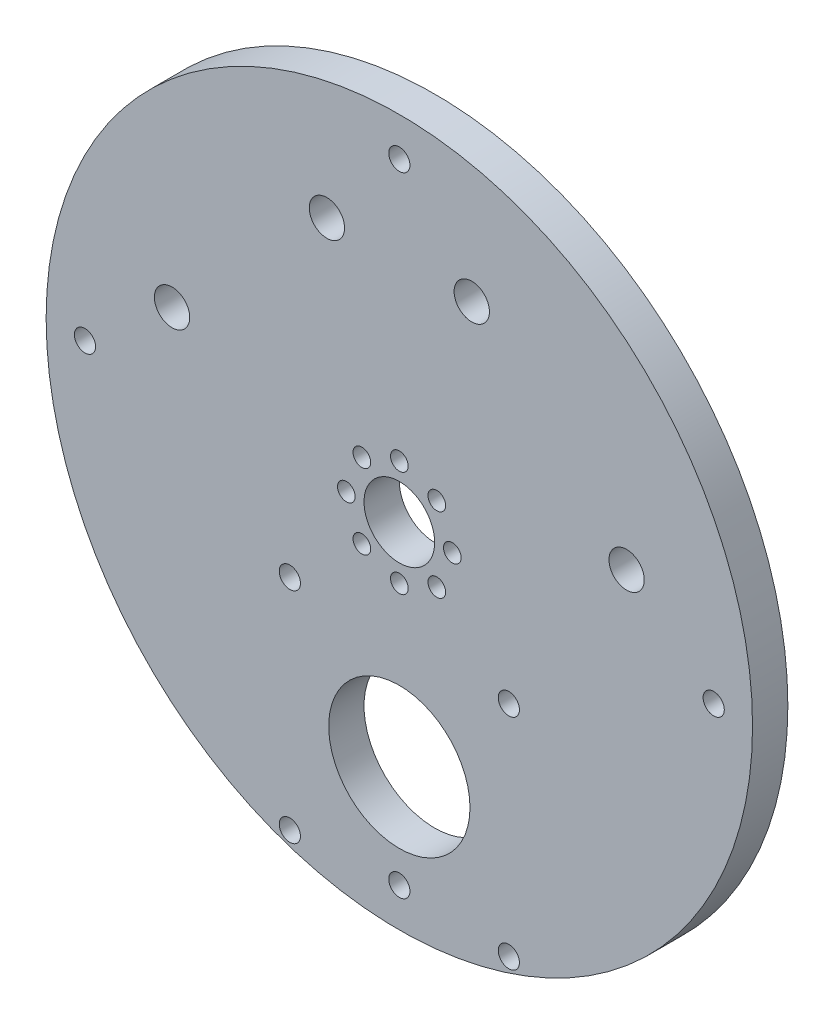
ISO-10303-21;
HEADER;
FILE_DESCRIPTION(('STEP AP214'),'2;1');
FILE_NAME('part.step','',(''),(''),'','','');
FILE_SCHEMA(('AUTOMOTIVE_DESIGN { 1 0 10303 214 1 1 1 1 }'));
ENDSEC;
DATA;
#1=APPLICATION_CONTEXT('core data for automotive mechanical design processes');
#2=APPLICATION_PROTOCOL_DEFINITION('international standard','automotive_design',2000,#1);
#3=PRODUCT_CONTEXT('',#1,'mechanical');
#4=PRODUCT('Part','Part','',(#3));
#5=PRODUCT_RELATED_PRODUCT_CATEGORY('part','',(#4));
#6=PRODUCT_DEFINITION_FORMATION('','',#4);
#7=PRODUCT_DEFINITION_CONTEXT('part definition',#1,'design');
#8=PRODUCT_DEFINITION('design','',#6,#7);
#9=PRODUCT_DEFINITION_SHAPE('','',#8);
#10=(LENGTH_UNIT() NAMED_UNIT(*) SI_UNIT(.MILLI.,.METRE.));
#11=(NAMED_UNIT(*) PLANE_ANGLE_UNIT() SI_UNIT($,.RADIAN.));
#12=(NAMED_UNIT(*) SI_UNIT($,.STERADIAN.) SOLID_ANGLE_UNIT());
#13=UNCERTAINTY_MEASURE_WITH_UNIT(LENGTH_MEASURE(1.E-05),#10,'distance_accuracy_value','');
#14=(GEOMETRIC_REPRESENTATION_CONTEXT(3) GLOBAL_UNCERTAINTY_ASSIGNED_CONTEXT((#13)) GLOBAL_UNIT_ASSIGNED_CONTEXT((#10,
#11,#12)) REPRESENTATION_CONTEXT('',''));
#15=CARTESIAN_POINT('',(0.,0.,0.));
#16=DIRECTION('',(0.,0.,1.));
#17=DIRECTION('',(1.,0.,0.));
#18=AXIS2_PLACEMENT_3D('',#15,#16,#17);
#19=CARTESIAN_POINT('',(0.,0.,5.));
#20=DIRECTION('',(0.,0.,1.));
#21=DIRECTION('',(1.,0.,0.));
#22=AXIS2_PLACEMENT_3D('',#19,#20,#21);
#23=PLANE('',#22);
#24=CARTESIAN_POINT('',(15.5,-45.5,5.));
#25=DIRECTION('',(0.,0.,1.));
#26=DIRECTION('',(1.,0.,0.));
#27=AXIS2_PLACEMENT_3D('',#24,#25,#26);
#28=CIRCLE('',#27,1.5);
#29=CARTESIAN_POINT('',(17.,-45.5,5.));
#30=VERTEX_POINT('',#29);
#31=EDGE_CURVE('E170',#30,#30,#28,.T.);
#32=ORIENTED_EDGE('',*,*,#31,.F.);
#33=EDGE_LOOP('',(#32));
#34=FACE_BOUND('',#33,.T.);
#35=CARTESIAN_POINT('',(-15.5,-14.5,5.));
#36=DIRECTION('',(0.,0.,1.));
#37=DIRECTION('',(1.,0.,0.));
#38=AXIS2_PLACEMENT_3D('',#35,#36,#37);
#39=CIRCLE('',#38,1.5);
#40=CARTESIAN_POINT('',(-14.,-14.5,5.));
#41=VERTEX_POINT('',#40);
#42=EDGE_CURVE('E158',#41,#41,#39,.T.);
#43=ORIENTED_EDGE('',*,*,#42,.F.);
#44=EDGE_LOOP('',(#43));
#45=FACE_BOUND('',#44,.T.);
#46=CARTESIAN_POINT('',(32.1733585439879,10.2530483272049,5.));
#47=DIRECTION('',(0.,0.,1.));
#48=DIRECTION('',(-1.,0.,0.));
#49=AXIS2_PLACEMENT_3D('',#46,#47,#48);
#50=CIRCLE('',#49,2.5);
#51=CARTESIAN_POINT('',(29.6733585439879,10.2530483272049,5.));
#52=VERTEX_POINT('',#51);
#53=EDGE_CURVE('E146',#52,#52,#50,.T.);
#54=ORIENTED_EDGE('',*,*,#53,.F.);
#55=EDGE_LOOP('',(#54));
#56=FACE_BOUND('',#55,.T.);
#57=CARTESIAN_POINT('',(-32.1733585439879,10.2530483272049,5.));
#58=DIRECTION('',(0.,0.,1.));
#59=DIRECTION('',(1.,0.,0.));
#60=AXIS2_PLACEMENT_3D('',#57,#58,#59);
#61=CIRCLE('',#60,2.5);
#62=CARTESIAN_POINT('',(-29.6733585439879,10.2530483272049,5.));
#63=VERTEX_POINT('',#62);
#64=EDGE_CURVE('E134',#63,#63,#61,.T.);
#65=ORIENTED_EDGE('',*,*,#64,.F.);
#66=EDGE_LOOP('',(#65));
#67=FACE_BOUND('',#66,.T.);
#68=CARTESIAN_POINT('',(-5.30330085889904,5.30330085889917,5.));
#69=DIRECTION('',(0.,0.,1.));
#70=DIRECTION('',(1.,0.,0.));
#71=AXIS2_PLACEMENT_3D('',#68,#69,#70);
#72=CIRCLE('',#71,1.25);
#73=CARTESIAN_POINT('',(-4.05330085889904,5.30330085889917,5.));
#74=VERTEX_POINT('',#73);
#75=EDGE_CURVE('E122',#74,#74,#72,.T.);
#76=ORIENTED_EDGE('',*,*,#75,.F.);
#77=EDGE_LOOP('',(#76));
#78=FACE_BOUND('',#77,.T.);
#79=CARTESIAN_POINT('',(-5.30330085889802,-5.30330085889956,5.));
#80=DIRECTION('',(0.,0.,1.));
#81=DIRECTION('',(1.,0.,0.));
#82=AXIS2_PLACEMENT_3D('',#79,#80,#81);
#83=CIRCLE('',#82,1.25000000000124);
#84=CARTESIAN_POINT('',(-4.05330085889678,-5.30330085889956,5.));
#85=VERTEX_POINT('',#84);
#86=EDGE_CURVE('E110',#85,#85,#83,.T.);
#87=ORIENTED_EDGE('',*,*,#86,.F.);
#88=EDGE_LOOP('',(#87));
#89=FACE_BOUND('',#88,.T.);
#90=CARTESIAN_POINT('',(5.3033008589002,-5.30330085889865,5.));
#91=DIRECTION('',(0.,0.,1.));
#92=DIRECTION('',(1.,0.,0.));
#93=AXIS2_PLACEMENT_3D('',#90,#91,#92);
#94=CIRCLE('',#93,1.25000000000095);
#95=CARTESIAN_POINT('',(6.55330085890114,-5.30330085889865,5.));
#96=VERTEX_POINT('',#95);
#97=EDGE_CURVE('E98',#96,#96,#94,.T.);
#98=ORIENTED_EDGE('',*,*,#97,.F.);
#99=EDGE_LOOP('',(#98));
#100=FACE_BOUND('',#99,.T.);
#101=CARTESIAN_POINT('',(5.30330085889912,5.3033008588991,5.));
#102=DIRECTION('',(0.,0.,1.));
#103=DIRECTION('',(1.,0.,0.));
#104=AXIS2_PLACEMENT_3D('',#101,#102,#103);
#105=CIRCLE('',#104,1.25);
#106=CARTESIAN_POINT('',(6.55330085889912,5.3033008588991,5.));
#107=VERTEX_POINT('',#106);
#108=EDGE_CURVE('E86',#107,#107,#105,.T.);
#109=ORIENTED_EDGE('',*,*,#108,.F.);
#110=EDGE_LOOP('',(#109));
#111=FACE_BOUND('',#110,.T.);
#112=CARTESIAN_POINT('',(-44.4999999999987,-1.26204123052488E-12,5.));
#113=DIRECTION('',(0.,0.,1.));
#114=DIRECTION('',(1.,0.,0.));
#115=AXIS2_PLACEMENT_3D('',#112,#113,#114);
#116=CIRCLE('',#115,1.50000000000202);
#117=CARTESIAN_POINT('',(-42.9999999999967,-1.26204123052488E-12,5.));
#118=VERTEX_POINT('',#117);
#119=EDGE_CURVE('E74',#118,#118,#116,.T.);
#120=ORIENTED_EDGE('',*,*,#119,.F.);
#121=EDGE_LOOP('',(#120));
#122=FACE_BOUND('',#121,.T.);
#123=CARTESIAN_POINT('',(44.5000000000012,1.25659155226867E-12,5.));
#124=DIRECTION('',(0.,0.,1.));
#125=DIRECTION('',(1.,0.,0.));
#126=AXIS2_PLACEMENT_3D('',#123,#124,#125);
#127=CIRCLE('',#126,1.50000000000099);
#128=CARTESIAN_POINT('',(46.0000000000022,1.25659155226867E-12,5.));
#129=VERTEX_POINT('',#128);
#130=EDGE_CURVE('E62',#129,#129,#127,.T.);
#131=ORIENTED_EDGE('',*,*,#130,.F.);
#132=EDGE_LOOP('',(#131));
#133=FACE_BOUND('',#132,.T.);
#134=CARTESIAN_POINT('',(0.,44.5,5.));
#135=DIRECTION('',(0.,0.,1.));
#136=DIRECTION('',(1.,0.,0.));
#137=AXIS2_PLACEMENT_3D('',#134,#135,#136);
#138=CIRCLE('',#137,1.5);
#139=CARTESIAN_POINT('',(1.5,44.5,5.));
#140=VERTEX_POINT('',#139);
#141=EDGE_CURVE('E51',#140,#140,#138,.T.);
#142=ORIENTED_EDGE('',*,*,#141,.F.);
#143=EDGE_LOOP('',(#142));
#144=FACE_BOUND('',#143,.T.);
#145=CARTESIAN_POINT('',(0.,0.,5.));
#146=DIRECTION('',(0.,0.,1.));
#147=DIRECTION('',(1.,0.,0.));
#148=AXIS2_PLACEMENT_3D('',#145,#146,#147);
#149=CIRCLE('',#148,50.);
#150=CARTESIAN_POINT('',(50.,0.,5.));
#151=VERTEX_POINT('',#150);
#152=EDGE_CURVE('E10',#151,#151,#149,.T.);
#153=ORIENTED_EDGE('',*,*,#152,.T.);
#154=EDGE_LOOP('',(#153));
#155=FACE_BOUND('',#154,.T.);
#156=CARTESIAN_POINT('',(0.,7.5,5.));
#157=DIRECTION('',(0.,0.,1.));
#158=DIRECTION('',(1.,0.,0.));
#159=AXIS2_PLACEMENT_3D('',#156,#157,#158);
#160=CIRCLE('',#159,1.25);
#161=CARTESIAN_POINT('',(1.25,7.5,5.));
#162=VERTEX_POINT('',#161);
#163=EDGE_CURVE('E56',#162,#162,#160,.T.);
#164=ORIENTED_EDGE('',*,*,#163,.F.);
#165=EDGE_LOOP('',(#164));
#166=FACE_BOUND('',#165,.T.);
#167=CARTESIAN_POINT('',(2.51318310453734E-12,-44.5,5.));
#168=DIRECTION('',(0.,0.,1.));
#169=DIRECTION('',(1.,0.,0.));
#170=AXIS2_PLACEMENT_3D('',#167,#168,#169);
#171=CIRCLE('',#170,1.5000000000027);
#172=CARTESIAN_POINT('',(1.50000000000522,-44.5,5.));
#173=VERTEX_POINT('',#172);
#174=EDGE_CURVE('E68',#173,#173,#171,.T.);
#175=ORIENTED_EDGE('',*,*,#174,.F.);
#176=EDGE_LOOP('',(#175));
#177=FACE_BOUND('',#176,.T.);
#178=CARTESIAN_POINT('',(0.,0.,5.));
#179=DIRECTION('',(0.,0.,1.));
#180=DIRECTION('',(1.,0.,0.));
#181=AXIS2_PLACEMENT_3D('',#178,#179,#180);
#182=CIRCLE('',#181,5.);
#183=CARTESIAN_POINT('',(5.,0.,5.));
#184=VERTEX_POINT('',#183);
#185=EDGE_CURVE('E80',#184,#184,#182,.T.);
#186=ORIENTED_EDGE('',*,*,#185,.F.);
#187=EDGE_LOOP('',(#186));
#188=FACE_BOUND('',#187,.T.);
#189=CARTESIAN_POINT('',(7.5,0.,5.));
#190=DIRECTION('',(0.,0.,1.));
#191=DIRECTION('',(1.,0.,0.));
#192=AXIS2_PLACEMENT_3D('',#189,#190,#191);
#193=CIRCLE('',#192,1.25);
#194=CARTESIAN_POINT('',(8.75,0.,5.));
#195=VERTEX_POINT('',#194);
#196=EDGE_CURVE('E92',#195,#195,#193,.T.);
#197=ORIENTED_EDGE('',*,*,#196,.F.);
#198=EDGE_LOOP('',(#197));
#199=FACE_BOUND('',#198,.T.);
#200=CARTESIAN_POINT('',(1.2762214690701E-12,-7.5,5.));
#201=DIRECTION('',(0.,0.,1.));
#202=DIRECTION('',(1.,0.,0.));
#203=AXIS2_PLACEMENT_3D('',#200,#201,#202);
#204=CIRCLE('',#203,1.25000000000127);
#205=CARTESIAN_POINT('',(1.25000000000255,-7.5,5.));
#206=VERTEX_POINT('',#205);
#207=EDGE_CURVE('E104',#206,#206,#204,.T.);
#208=ORIENTED_EDGE('',*,*,#207,.F.);
#209=EDGE_LOOP('',(#208));
#210=FACE_BOUND('',#209,.T.);
#211=CARTESIAN_POINT('',(-7.5,0.,5.));
#212=DIRECTION('',(0.,0.,1.));
#213=DIRECTION('',(1.,0.,0.));
#214=AXIS2_PLACEMENT_3D('',#211,#212,#213);
#215=CIRCLE('',#214,1.25);
#216=CARTESIAN_POINT('',(-6.25,0.,5.));
#217=VERTEX_POINT('',#216);
#218=EDGE_CURVE('E116',#217,#217,#215,.T.);
#219=ORIENTED_EDGE('',*,*,#218,.F.);
#220=EDGE_LOOP('',(#219));
#221=FACE_BOUND('',#220,.T.);
#222=CARTESIAN_POINT('',(-10.2530483272049,32.1733585439879,5.));
#223=DIRECTION('',(0.,0.,1.));
#224=DIRECTION('',(1.,0.,0.));
#225=AXIS2_PLACEMENT_3D('',#222,#223,#224);
#226=CIRCLE('',#225,2.5);
#227=CARTESIAN_POINT('',(-7.75304832720494,32.1733585439879,5.));
#228=VERTEX_POINT('',#227);
#229=EDGE_CURVE('E128',#228,#228,#226,.T.);
#230=ORIENTED_EDGE('',*,*,#229,.F.);
#231=EDGE_LOOP('',(#230));
#232=FACE_BOUND('',#231,.T.);
#233=CARTESIAN_POINT('',(10.2530483272049,32.1733585439879,5.));
#234=DIRECTION('',(0.,0.,1.));
#235=DIRECTION('',(-1.,0.,0.));
#236=AXIS2_PLACEMENT_3D('',#233,#234,#235);
#237=CIRCLE('',#236,2.5);
#238=CARTESIAN_POINT('',(7.75304832720494,32.1733585439879,5.));
#239=VERTEX_POINT('',#238);
#240=EDGE_CURVE('E140',#239,#239,#237,.T.);
#241=ORIENTED_EDGE('',*,*,#240,.F.);
#242=EDGE_LOOP('',(#241));
#243=FACE_BOUND('',#242,.T.);
#244=CARTESIAN_POINT('',(0.,-30.,5.));
#245=DIRECTION('',(0.,0.,1.));
#246=DIRECTION('',(1.,0.,0.));
#247=AXIS2_PLACEMENT_3D('',#244,#245,#246);
#248=CIRCLE('',#247,10.);
#249=CARTESIAN_POINT('',(10.,-30.,5.));
#250=VERTEX_POINT('',#249);
#251=EDGE_CURVE('E152',#250,#250,#248,.T.);
#252=ORIENTED_EDGE('',*,*,#251,.F.);
#253=EDGE_LOOP('',(#252));
#254=FACE_BOUND('',#253,.T.);
#255=CARTESIAN_POINT('',(15.5,-14.5,5.));
#256=DIRECTION('',(0.,0.,1.));
#257=DIRECTION('',(1.,0.,0.));
#258=AXIS2_PLACEMENT_3D('',#255,#256,#257);
#259=CIRCLE('',#258,1.5);
#260=CARTESIAN_POINT('',(17.,-14.5,5.));
#261=VERTEX_POINT('',#260);
#262=EDGE_CURVE('E164',#261,#261,#259,.T.);
#263=ORIENTED_EDGE('',*,*,#262,.F.);
#264=EDGE_LOOP('',(#263));
#265=FACE_BOUND('',#264,.T.);
#266=CARTESIAN_POINT('',(-15.5,-45.5,5.));
#267=DIRECTION('',(0.,0.,1.));
#268=DIRECTION('',(1.,0.,0.));
#269=AXIS2_PLACEMENT_3D('',#266,#267,#268);
#270=CIRCLE('',#269,1.5);
#271=CARTESIAN_POINT('',(-14.,-45.5,5.));
#272=VERTEX_POINT('',#271);
#273=EDGE_CURVE('E176',#272,#272,#270,.T.);
#274=ORIENTED_EDGE('',*,*,#273,.F.);
#275=EDGE_LOOP('',(#274));
#276=FACE_BOUND('',#275,.T.);
#277=ADVANCED_FACE('F40',(#34,#45,#56,#67,#78,#89,#100,#111,#122,#133,#144,#155,#166,#177,#188,
#199,#210,#221,#232,#243,#254,#265,#276),#23,.T.);
#278=CARTESIAN_POINT('',(0.,0.,0.));
#279=DIRECTION('',(0.,0.,1.));
#280=DIRECTION('',(1.,0.,0.));
#281=AXIS2_PLACEMENT_3D('',#278,#279,#280);
#282=PLANE('',#281);
#283=CARTESIAN_POINT('',(0.,0.,0.));
#284=DIRECTION('',(0.,0.,1.));
#285=DIRECTION('',(1.,0.,0.));
#286=AXIS2_PLACEMENT_3D('',#283,#284,#285);
#287=CIRCLE('',#286,50.);
#288=CARTESIAN_POINT('',(50.,0.,0.));
#289=VERTEX_POINT('',#288);
#290=EDGE_CURVE('E44',#289,#289,#287,.T.);
#291=ORIENTED_EDGE('',*,*,#290,.F.);
#292=EDGE_LOOP('',(#291));
#293=FACE_BOUND('',#292,.T.);
#294=CARTESIAN_POINT('',(0.,44.5,0.));
#295=DIRECTION('',(0.,0.,1.));
#296=DIRECTION('',(1.,0.,0.));
#297=AXIS2_PLACEMENT_3D('',#294,#295,#296);
#298=CIRCLE('',#297,1.5);
#299=CARTESIAN_POINT('',(1.5,44.5,0.));
#300=VERTEX_POINT('',#299);
#301=EDGE_CURVE('E53',#300,#300,#298,.T.);
#302=ORIENTED_EDGE('',*,*,#301,.T.);
#303=EDGE_LOOP('',(#302));
#304=FACE_BOUND('',#303,.T.);
#305=CARTESIAN_POINT('',(0.,7.5,0.));
#306=DIRECTION('',(0.,0.,1.));
#307=DIRECTION('',(1.,0.,0.));
#308=AXIS2_PLACEMENT_3D('',#305,#306,#307);
#309=CIRCLE('',#308,1.25);
#310=CARTESIAN_POINT('',(1.25,7.5,0.));
#311=VERTEX_POINT('',#310);
#312=EDGE_CURVE('E59',#311,#311,#309,.T.);
#313=ORIENTED_EDGE('',*,*,#312,.T.);
#314=EDGE_LOOP('',(#313));
#315=FACE_BOUND('',#314,.T.);
#316=CARTESIAN_POINT('',(44.5000000000012,1.25659155226867E-12,0.));
#317=DIRECTION('',(0.,0.,1.));
#318=DIRECTION('',(1.,0.,0.));
#319=AXIS2_PLACEMENT_3D('',#316,#317,#318);
#320=CIRCLE('',#319,1.50000000000099);
#321=CARTESIAN_POINT('',(46.0000000000022,1.25659155226867E-12,0.));
#322=VERTEX_POINT('',#321);
#323=EDGE_CURVE('E65',#322,#322,#320,.T.);
#324=ORIENTED_EDGE('',*,*,#323,.T.);
#325=EDGE_LOOP('',(#324));
#326=FACE_BOUND('',#325,.T.);
#327=CARTESIAN_POINT('',(2.51318310453734E-12,-44.5,0.));
#328=DIRECTION('',(0.,0.,1.));
#329=DIRECTION('',(1.,0.,0.));
#330=AXIS2_PLACEMENT_3D('',#327,#328,#329);
#331=CIRCLE('',#330,1.5000000000027);
#332=CARTESIAN_POINT('',(1.50000000000522,-44.5,0.));
#333=VERTEX_POINT('',#332);
#334=EDGE_CURVE('E71',#333,#333,#331,.T.);
#335=ORIENTED_EDGE('',*,*,#334,.T.);
#336=EDGE_LOOP('',(#335));
#337=FACE_BOUND('',#336,.T.);
#338=CARTESIAN_POINT('',(-44.4999999999987,-1.26204123052488E-12,0.));
#339=DIRECTION('',(0.,0.,1.));
#340=DIRECTION('',(1.,0.,0.));
#341=AXIS2_PLACEMENT_3D('',#338,#339,#340);
#342=CIRCLE('',#341,1.50000000000202);
#343=CARTESIAN_POINT('',(-42.9999999999967,-1.26204123052488E-12,0.));
#344=VERTEX_POINT('',#343);
#345=EDGE_CURVE('E77',#344,#344,#342,.T.);
#346=ORIENTED_EDGE('',*,*,#345,.T.);
#347=EDGE_LOOP('',(#346));
#348=FACE_BOUND('',#347,.T.);
#349=CARTESIAN_POINT('',(0.,0.,0.));
#350=DIRECTION('',(0.,0.,1.));
#351=DIRECTION('',(1.,0.,0.));
#352=AXIS2_PLACEMENT_3D('',#349,#350,#351);
#353=CIRCLE('',#352,5.);
#354=CARTESIAN_POINT('',(5.,0.,0.));
#355=VERTEX_POINT('',#354);
#356=EDGE_CURVE('E83',#355,#355,#353,.T.);
#357=ORIENTED_EDGE('',*,*,#356,.T.);
#358=EDGE_LOOP('',(#357));
#359=FACE_BOUND('',#358,.T.);
#360=CARTESIAN_POINT('',(5.30330085889912,5.3033008588991,0.));
#361=DIRECTION('',(0.,0.,1.));
#362=DIRECTION('',(1.,0.,0.));
#363=AXIS2_PLACEMENT_3D('',#360,#361,#362);
#364=CIRCLE('',#363,1.25);
#365=CARTESIAN_POINT('',(6.55330085889912,5.3033008588991,0.));
#366=VERTEX_POINT('',#365);
#367=EDGE_CURVE('E89',#366,#366,#364,.T.);
#368=ORIENTED_EDGE('',*,*,#367,.T.);
#369=EDGE_LOOP('',(#368));
#370=FACE_BOUND('',#369,.T.);
#371=CARTESIAN_POINT('',(7.5,0.,0.));
#372=DIRECTION('',(0.,0.,1.));
#373=DIRECTION('',(1.,0.,0.));
#374=AXIS2_PLACEMENT_3D('',#371,#372,#373);
#375=CIRCLE('',#374,1.25);
#376=CARTESIAN_POINT('',(8.75,0.,0.));
#377=VERTEX_POINT('',#376);
#378=EDGE_CURVE('E95',#377,#377,#375,.T.);
#379=ORIENTED_EDGE('',*,*,#378,.T.);
#380=EDGE_LOOP('',(#379));
#381=FACE_BOUND('',#380,.T.);
#382=CARTESIAN_POINT('',(5.3033008589002,-5.30330085889865,0.));
#383=DIRECTION('',(0.,0.,1.));
#384=DIRECTION('',(1.,0.,0.));
#385=AXIS2_PLACEMENT_3D('',#382,#383,#384);
#386=CIRCLE('',#385,1.25000000000095);
#387=CARTESIAN_POINT('',(6.55330085890114,-5.30330085889865,0.));
#388=VERTEX_POINT('',#387);
#389=EDGE_CURVE('E101',#388,#388,#386,.T.);
#390=ORIENTED_EDGE('',*,*,#389,.T.);
#391=EDGE_LOOP('',(#390));
#392=FACE_BOUND('',#391,.T.);
#393=CARTESIAN_POINT('',(1.2762214690701E-12,-7.5,0.));
#394=DIRECTION('',(0.,0.,1.));
#395=DIRECTION('',(1.,0.,0.));
#396=AXIS2_PLACEMENT_3D('',#393,#394,#395);
#397=CIRCLE('',#396,1.25000000000127);
#398=CARTESIAN_POINT('',(1.25000000000255,-7.5,0.));
#399=VERTEX_POINT('',#398);
#400=EDGE_CURVE('E107',#399,#399,#397,.T.);
#401=ORIENTED_EDGE('',*,*,#400,.T.);
#402=EDGE_LOOP('',(#401));
#403=FACE_BOUND('',#402,.T.);
#404=CARTESIAN_POINT('',(-5.30330085889802,-5.30330085889956,0.));
#405=DIRECTION('',(0.,0.,1.));
#406=DIRECTION('',(1.,0.,0.));
#407=AXIS2_PLACEMENT_3D('',#404,#405,#406);
#408=CIRCLE('',#407,1.25000000000124);
#409=CARTESIAN_POINT('',(-4.05330085889678,-5.30330085889956,0.));
#410=VERTEX_POINT('',#409);
#411=EDGE_CURVE('E113',#410,#410,#408,.T.);
#412=ORIENTED_EDGE('',*,*,#411,.T.);
#413=EDGE_LOOP('',(#412));
#414=FACE_BOUND('',#413,.T.);
#415=CARTESIAN_POINT('',(-7.5,0.,0.));
#416=DIRECTION('',(0.,0.,1.));
#417=DIRECTION('',(1.,0.,0.));
#418=AXIS2_PLACEMENT_3D('',#415,#416,#417);
#419=CIRCLE('',#418,1.25);
#420=CARTESIAN_POINT('',(-6.25,0.,0.));
#421=VERTEX_POINT('',#420);
#422=EDGE_CURVE('E119',#421,#421,#419,.T.);
#423=ORIENTED_EDGE('',*,*,#422,.T.);
#424=EDGE_LOOP('',(#423));
#425=FACE_BOUND('',#424,.T.);
#426=CARTESIAN_POINT('',(-5.30330085889904,5.30330085889917,0.));
#427=DIRECTION('',(0.,0.,1.));
#428=DIRECTION('',(1.,0.,0.));
#429=AXIS2_PLACEMENT_3D('',#426,#427,#428);
#430=CIRCLE('',#429,1.25);
#431=CARTESIAN_POINT('',(-4.05330085889904,5.30330085889917,0.));
#432=VERTEX_POINT('',#431);
#433=EDGE_CURVE('E125',#432,#432,#430,.T.);
#434=ORIENTED_EDGE('',*,*,#433,.T.);
#435=EDGE_LOOP('',(#434));
#436=FACE_BOUND('',#435,.T.);
#437=CARTESIAN_POINT('',(-10.2530483272049,32.1733585439879,0.));
#438=DIRECTION('',(0.,0.,1.));
#439=DIRECTION('',(1.,0.,0.));
#440=AXIS2_PLACEMENT_3D('',#437,#438,#439);
#441=CIRCLE('',#440,2.5);
#442=CARTESIAN_POINT('',(-7.75304832720494,32.1733585439879,0.));
#443=VERTEX_POINT('',#442);
#444=EDGE_CURVE('E131',#443,#443,#441,.T.);
#445=ORIENTED_EDGE('',*,*,#444,.T.);
#446=EDGE_LOOP('',(#445));
#447=FACE_BOUND('',#446,.T.);
#448=CARTESIAN_POINT('',(-32.1733585439879,10.2530483272049,0.));
#449=DIRECTION('',(0.,0.,1.));
#450=DIRECTION('',(1.,0.,0.));
#451=AXIS2_PLACEMENT_3D('',#448,#449,#450);
#452=CIRCLE('',#451,2.5);
#453=CARTESIAN_POINT('',(-29.6733585439879,10.2530483272049,0.));
#454=VERTEX_POINT('',#453);
#455=EDGE_CURVE('E137',#454,#454,#452,.T.);
#456=ORIENTED_EDGE('',*,*,#455,.T.);
#457=EDGE_LOOP('',(#456));
#458=FACE_BOUND('',#457,.T.);
#459=CARTESIAN_POINT('',(10.2530483272049,32.1733585439879,0.));
#460=DIRECTION('',(0.,0.,1.));
#461=DIRECTION('',(-1.,0.,0.));
#462=AXIS2_PLACEMENT_3D('',#459,#460,#461);
#463=CIRCLE('',#462,2.5);
#464=CARTESIAN_POINT('',(7.75304832720494,32.1733585439879,0.));
#465=VERTEX_POINT('',#464);
#466=EDGE_CURVE('E143',#465,#465,#463,.T.);
#467=ORIENTED_EDGE('',*,*,#466,.T.);
#468=EDGE_LOOP('',(#467));
#469=FACE_BOUND('',#468,.T.);
#470=CARTESIAN_POINT('',(32.1733585439879,10.2530483272049,0.));
#471=DIRECTION('',(0.,0.,1.));
#472=DIRECTION('',(-1.,0.,0.));
#473=AXIS2_PLACEMENT_3D('',#470,#471,#472);
#474=CIRCLE('',#473,2.5);
#475=CARTESIAN_POINT('',(29.6733585439879,10.2530483272049,0.));
#476=VERTEX_POINT('',#475);
#477=EDGE_CURVE('E149',#476,#476,#474,.T.);
#478=ORIENTED_EDGE('',*,*,#477,.T.);
#479=EDGE_LOOP('',(#478));
#480=FACE_BOUND('',#479,.T.);
#481=CARTESIAN_POINT('',(0.,-30.,0.));
#482=DIRECTION('',(0.,0.,1.));
#483=DIRECTION('',(1.,0.,0.));
#484=AXIS2_PLACEMENT_3D('',#481,#482,#483);
#485=CIRCLE('',#484,10.);
#486=CARTESIAN_POINT('',(10.,-30.,0.));
#487=VERTEX_POINT('',#486);
#488=EDGE_CURVE('E155',#487,#487,#485,.T.);
#489=ORIENTED_EDGE('',*,*,#488,.T.);
#490=EDGE_LOOP('',(#489));
#491=FACE_BOUND('',#490,.T.);
#492=CARTESIAN_POINT('',(-15.5,-14.5,0.));
#493=DIRECTION('',(0.,0.,1.));
#494=DIRECTION('',(1.,0.,0.));
#495=AXIS2_PLACEMENT_3D('',#492,#493,#494);
#496=CIRCLE('',#495,1.5);
#497=CARTESIAN_POINT('',(-14.,-14.5,0.));
#498=VERTEX_POINT('',#497);
#499=EDGE_CURVE('E161',#498,#498,#496,.T.);
#500=ORIENTED_EDGE('',*,*,#499,.T.);
#501=EDGE_LOOP('',(#500));
#502=FACE_BOUND('',#501,.T.);
#503=CARTESIAN_POINT('',(15.5,-14.5,0.));
#504=DIRECTION('',(0.,0.,1.));
#505=DIRECTION('',(1.,0.,0.));
#506=AXIS2_PLACEMENT_3D('',#503,#504,#505);
#507=CIRCLE('',#506,1.5);
#508=CARTESIAN_POINT('',(17.,-14.5,0.));
#509=VERTEX_POINT('',#508);
#510=EDGE_CURVE('E167',#509,#509,#507,.T.);
#511=ORIENTED_EDGE('',*,*,#510,.T.);
#512=EDGE_LOOP('',(#511));
#513=FACE_BOUND('',#512,.T.);
#514=CARTESIAN_POINT('',(15.5,-45.5,0.));
#515=DIRECTION('',(0.,0.,1.));
#516=DIRECTION('',(1.,0.,0.));
#517=AXIS2_PLACEMENT_3D('',#514,#515,#516);
#518=CIRCLE('',#517,1.5);
#519=CARTESIAN_POINT('',(17.,-45.5,0.));
#520=VERTEX_POINT('',#519);
#521=EDGE_CURVE('E173',#520,#520,#518,.T.);
#522=ORIENTED_EDGE('',*,*,#521,.T.);
#523=EDGE_LOOP('',(#522));
#524=FACE_BOUND('',#523,.T.);
#525=CARTESIAN_POINT('',(-15.5,-45.5,0.));
#526=DIRECTION('',(0.,0.,1.));
#527=DIRECTION('',(1.,0.,0.));
#528=AXIS2_PLACEMENT_3D('',#525,#526,#527);
#529=CIRCLE('',#528,1.5);
#530=CARTESIAN_POINT('',(-14.,-45.5,0.));
#531=VERTEX_POINT('',#530);
#532=EDGE_CURVE('E179',#531,#531,#529,.T.);
#533=ORIENTED_EDGE('',*,*,#532,.T.);
#534=EDGE_LOOP('',(#533));
#535=FACE_BOUND('',#534,.T.);
#536=ADVANCED_FACE('F189',(#293,#304,#315,#326,#337,#348,#359,#370,#381,#392,#403,#414,#425,
#436,#447,#458,#469,#480,#491,#502,#513,#524,#535),#282,.F.);
#537=CARTESIAN_POINT('',(0.,0.,5.));
#538=DIRECTION('',(0.,0.,-1.));
#539=DIRECTION('',(-1.,0.,0.));
#540=AXIS2_PLACEMENT_3D('',#537,#538,#539);
#541=CYLINDRICAL_SURFACE('',#540,50.);
#542=ORIENTED_EDGE('',*,*,#152,.F.);
#543=EDGE_LOOP('',(#542));
#544=FACE_BOUND('',#543,.T.);
#545=ORIENTED_EDGE('',*,*,#290,.T.);
#546=EDGE_LOOP('',(#545));
#547=FACE_BOUND('',#546,.T.);
#548=ADVANCED_FACE('F42',(#544,#547),#541,.T.);
#549=CARTESIAN_POINT('',(0.,44.5,5.));
#550=DIRECTION('',(0.,0.,-1.));
#551=DIRECTION('',(-1.,0.,0.));
#552=AXIS2_PLACEMENT_3D('',#549,#550,#551);
#553=CYLINDRICAL_SURFACE('',#552,1.5);
#554=ORIENTED_EDGE('',*,*,#141,.T.);
#555=EDGE_LOOP('',(#554));
#556=FACE_BOUND('',#555,.T.);
#557=ORIENTED_EDGE('',*,*,#301,.F.);
#558=EDGE_LOOP('',(#557));
#559=FACE_BOUND('',#558,.T.);
#560=ADVANCED_FACE('F199',(#556,#559),#553,.F.);
#561=CARTESIAN_POINT('',(0.,7.5,5.));
#562=DIRECTION('',(0.,0.,-1.));
#563=DIRECTION('',(-1.,0.,0.));
#564=AXIS2_PLACEMENT_3D('',#561,#562,#563);
#565=CYLINDRICAL_SURFACE('',#564,1.25);
#566=ORIENTED_EDGE('',*,*,#163,.T.);
#567=EDGE_LOOP('',(#566));
#568=FACE_BOUND('',#567,.T.);
#569=ORIENTED_EDGE('',*,*,#312,.F.);
#570=EDGE_LOOP('',(#569));
#571=FACE_BOUND('',#570,.T.);
#572=ADVANCED_FACE('F202',(#568,#571),#565,.F.);
#573=CARTESIAN_POINT('',(44.5000000000012,1.25659155226867E-12,5.));
#574=DIRECTION('',(0.,0.,-1.));
#575=DIRECTION('',(-1.,0.,0.));
#576=AXIS2_PLACEMENT_3D('',#573,#574,#575);
#577=CYLINDRICAL_SURFACE('',#576,1.50000000000099);
#578=ORIENTED_EDGE('',*,*,#130,.T.);
#579=EDGE_LOOP('',(#578));
#580=FACE_BOUND('',#579,.T.);
#581=ORIENTED_EDGE('',*,*,#323,.F.);
#582=EDGE_LOOP('',(#581));
#583=FACE_BOUND('',#582,.T.);
#584=ADVANCED_FACE('F206',(#580,#583),#577,.F.);
#585=CARTESIAN_POINT('',(2.51318310453734E-12,-44.5,5.));
#586=DIRECTION('',(0.,0.,-1.));
#587=DIRECTION('',(-1.,0.,0.));
#588=AXIS2_PLACEMENT_3D('',#585,#586,#587);
#589=CYLINDRICAL_SURFACE('',#588,1.5000000000027);
#590=ORIENTED_EDGE('',*,*,#174,.T.);
#591=EDGE_LOOP('',(#590));
#592=FACE_BOUND('',#591,.T.);
#593=ORIENTED_EDGE('',*,*,#334,.F.);
#594=EDGE_LOOP('',(#593));
#595=FACE_BOUND('',#594,.T.);
#596=ADVANCED_FACE('F210',(#592,#595),#589,.F.);
#597=CARTESIAN_POINT('',(-44.4999999999987,-1.26204123052488E-12,5.));
#598=DIRECTION('',(0.,0.,-1.));
#599=DIRECTION('',(-1.,0.,0.));
#600=AXIS2_PLACEMENT_3D('',#597,#598,#599);
#601=CYLINDRICAL_SURFACE('',#600,1.50000000000202);
#602=ORIENTED_EDGE('',*,*,#119,.T.);
#603=EDGE_LOOP('',(#602));
#604=FACE_BOUND('',#603,.T.);
#605=ORIENTED_EDGE('',*,*,#345,.F.);
#606=EDGE_LOOP('',(#605));
#607=FACE_BOUND('',#606,.T.);
#608=ADVANCED_FACE('F214',(#604,#607),#601,.F.);
#609=CARTESIAN_POINT('',(0.,0.,5.));
#610=DIRECTION('',(0.,0.,-1.));
#611=DIRECTION('',(-1.,0.,0.));
#612=AXIS2_PLACEMENT_3D('',#609,#610,#611);
#613=CYLINDRICAL_SURFACE('',#612,5.);
#614=ORIENTED_EDGE('',*,*,#185,.T.);
#615=EDGE_LOOP('',(#614));
#616=FACE_BOUND('',#615,.T.);
#617=ORIENTED_EDGE('',*,*,#356,.F.);
#618=EDGE_LOOP('',(#617));
#619=FACE_BOUND('',#618,.T.);
#620=ADVANCED_FACE('F218',(#616,#619),#613,.F.);
#621=CARTESIAN_POINT('',(5.30330085889912,5.3033008588991,5.));
#622=DIRECTION('',(0.,0.,-1.));
#623=DIRECTION('',(-1.,0.,0.));
#624=AXIS2_PLACEMENT_3D('',#621,#622,#623);
#625=CYLINDRICAL_SURFACE('',#624,1.25);
#626=ORIENTED_EDGE('',*,*,#108,.T.);
#627=EDGE_LOOP('',(#626));
#628=FACE_BOUND('',#627,.T.);
#629=ORIENTED_EDGE('',*,*,#367,.F.);
#630=EDGE_LOOP('',(#629));
#631=FACE_BOUND('',#630,.T.);
#632=ADVANCED_FACE('F222',(#628,#631),#625,.F.);
#633=CARTESIAN_POINT('',(7.5,0.,5.));
#634=DIRECTION('',(0.,0.,-1.));
#635=DIRECTION('',(-1.,0.,0.));
#636=AXIS2_PLACEMENT_3D('',#633,#634,#635);
#637=CYLINDRICAL_SURFACE('',#636,1.25);
#638=ORIENTED_EDGE('',*,*,#196,.T.);
#639=EDGE_LOOP('',(#638));
#640=FACE_BOUND('',#639,.T.);
#641=ORIENTED_EDGE('',*,*,#378,.F.);
#642=EDGE_LOOP('',(#641));
#643=FACE_BOUND('',#642,.T.);
#644=ADVANCED_FACE('F226',(#640,#643),#637,.F.);
#645=CARTESIAN_POINT('',(5.3033008589002,-5.30330085889865,5.));
#646=DIRECTION('',(0.,0.,-1.));
#647=DIRECTION('',(-1.,0.,0.));
#648=AXIS2_PLACEMENT_3D('',#645,#646,#647);
#649=CYLINDRICAL_SURFACE('',#648,1.25000000000095);
#650=ORIENTED_EDGE('',*,*,#97,.T.);
#651=EDGE_LOOP('',(#650));
#652=FACE_BOUND('',#651,.T.);
#653=ORIENTED_EDGE('',*,*,#389,.F.);
#654=EDGE_LOOP('',(#653));
#655=FACE_BOUND('',#654,.T.);
#656=ADVANCED_FACE('F230',(#652,#655),#649,.F.);
#657=CARTESIAN_POINT('',(1.2762214690701E-12,-7.5,5.));
#658=DIRECTION('',(0.,0.,-1.));
#659=DIRECTION('',(-1.,0.,0.));
#660=AXIS2_PLACEMENT_3D('',#657,#658,#659);
#661=CYLINDRICAL_SURFACE('',#660,1.25000000000127);
#662=ORIENTED_EDGE('',*,*,#207,.T.);
#663=EDGE_LOOP('',(#662));
#664=FACE_BOUND('',#663,.T.);
#665=ORIENTED_EDGE('',*,*,#400,.F.);
#666=EDGE_LOOP('',(#665));
#667=FACE_BOUND('',#666,.T.);
#668=ADVANCED_FACE('F234',(#664,#667),#661,.F.);
#669=CARTESIAN_POINT('',(-5.30330085889802,-5.30330085889956,5.));
#670=DIRECTION('',(0.,0.,-1.));
#671=DIRECTION('',(-1.,0.,0.));
#672=AXIS2_PLACEMENT_3D('',#669,#670,#671);
#673=CYLINDRICAL_SURFACE('',#672,1.25000000000124);
#674=ORIENTED_EDGE('',*,*,#86,.T.);
#675=EDGE_LOOP('',(#674));
#676=FACE_BOUND('',#675,.T.);
#677=ORIENTED_EDGE('',*,*,#411,.F.);
#678=EDGE_LOOP('',(#677));
#679=FACE_BOUND('',#678,.T.);
#680=ADVANCED_FACE('F238',(#676,#679),#673,.F.);
#681=CARTESIAN_POINT('',(-7.5,0.,5.));
#682=DIRECTION('',(0.,0.,-1.));
#683=DIRECTION('',(-1.,0.,0.));
#684=AXIS2_PLACEMENT_3D('',#681,#682,#683);
#685=CYLINDRICAL_SURFACE('',#684,1.25);
#686=ORIENTED_EDGE('',*,*,#218,.T.);
#687=EDGE_LOOP('',(#686));
#688=FACE_BOUND('',#687,.T.);
#689=ORIENTED_EDGE('',*,*,#422,.F.);
#690=EDGE_LOOP('',(#689));
#691=FACE_BOUND('',#690,.T.);
#692=ADVANCED_FACE('F242',(#688,#691),#685,.F.);
#693=CARTESIAN_POINT('',(-5.30330085889904,5.30330085889917,5.));
#694=DIRECTION('',(0.,0.,-1.));
#695=DIRECTION('',(-1.,0.,0.));
#696=AXIS2_PLACEMENT_3D('',#693,#694,#695);
#697=CYLINDRICAL_SURFACE('',#696,1.25);
#698=ORIENTED_EDGE('',*,*,#75,.T.);
#699=EDGE_LOOP('',(#698));
#700=FACE_BOUND('',#699,.T.);
#701=ORIENTED_EDGE('',*,*,#433,.F.);
#702=EDGE_LOOP('',(#701));
#703=FACE_BOUND('',#702,.T.);
#704=ADVANCED_FACE('F246',(#700,#703),#697,.F.);
#705=CARTESIAN_POINT('',(-10.2530483272049,32.1733585439879,5.));
#706=DIRECTION('',(0.,0.,-1.));
#707=DIRECTION('',(-1.,0.,0.));
#708=AXIS2_PLACEMENT_3D('',#705,#706,#707);
#709=CYLINDRICAL_SURFACE('',#708,2.5);
#710=ORIENTED_EDGE('',*,*,#229,.T.);
#711=EDGE_LOOP('',(#710));
#712=FACE_BOUND('',#711,.T.);
#713=ORIENTED_EDGE('',*,*,#444,.F.);
#714=EDGE_LOOP('',(#713));
#715=FACE_BOUND('',#714,.T.);
#716=ADVANCED_FACE('F250',(#712,#715),#709,.F.);
#717=CARTESIAN_POINT('',(-32.1733585439879,10.2530483272049,5.));
#718=DIRECTION('',(0.,0.,-1.));
#719=DIRECTION('',(-1.,0.,0.));
#720=AXIS2_PLACEMENT_3D('',#717,#718,#719);
#721=CYLINDRICAL_SURFACE('',#720,2.5);
#722=ORIENTED_EDGE('',*,*,#64,.T.);
#723=EDGE_LOOP('',(#722));
#724=FACE_BOUND('',#723,.T.);
#725=ORIENTED_EDGE('',*,*,#455,.F.);
#726=EDGE_LOOP('',(#725));
#727=FACE_BOUND('',#726,.T.);
#728=ADVANCED_FACE('F254',(#724,#727),#721,.F.);
#729=CARTESIAN_POINT('',(10.2530483272049,32.1733585439879,5.));
#730=DIRECTION('',(0.,0.,-1.));
#731=DIRECTION('',(-1.,0.,0.));
#732=AXIS2_PLACEMENT_3D('',#729,#730,#731);
#733=CYLINDRICAL_SURFACE('',#732,2.5);
#734=ORIENTED_EDGE('',*,*,#240,.T.);
#735=EDGE_LOOP('',(#734));
#736=FACE_BOUND('',#735,.T.);
#737=ORIENTED_EDGE('',*,*,#466,.F.);
#738=EDGE_LOOP('',(#737));
#739=FACE_BOUND('',#738,.T.);
#740=ADVANCED_FACE('F258',(#736,#739),#733,.F.);
#741=CARTESIAN_POINT('',(32.1733585439879,10.2530483272049,5.));
#742=DIRECTION('',(0.,0.,-1.));
#743=DIRECTION('',(-1.,0.,0.));
#744=AXIS2_PLACEMENT_3D('',#741,#742,#743);
#745=CYLINDRICAL_SURFACE('',#744,2.5);
#746=ORIENTED_EDGE('',*,*,#53,.T.);
#747=EDGE_LOOP('',(#746));
#748=FACE_BOUND('',#747,.T.);
#749=ORIENTED_EDGE('',*,*,#477,.F.);
#750=EDGE_LOOP('',(#749));
#751=FACE_BOUND('',#750,.T.);
#752=ADVANCED_FACE('F262',(#748,#751),#745,.F.);
#753=CARTESIAN_POINT('',(0.,-30.,5.));
#754=DIRECTION('',(0.,0.,-1.));
#755=DIRECTION('',(-1.,0.,0.));
#756=AXIS2_PLACEMENT_3D('',#753,#754,#755);
#757=CYLINDRICAL_SURFACE('',#756,10.);
#758=ORIENTED_EDGE('',*,*,#251,.T.);
#759=EDGE_LOOP('',(#758));
#760=FACE_BOUND('',#759,.T.);
#761=ORIENTED_EDGE('',*,*,#488,.F.);
#762=EDGE_LOOP('',(#761));
#763=FACE_BOUND('',#762,.T.);
#764=ADVANCED_FACE('F266',(#760,#763),#757,.F.);
#765=CARTESIAN_POINT('',(-15.5,-14.5,5.));
#766=DIRECTION('',(0.,0.,-1.));
#767=DIRECTION('',(-1.,0.,0.));
#768=AXIS2_PLACEMENT_3D('',#765,#766,#767);
#769=CYLINDRICAL_SURFACE('',#768,1.5);
#770=ORIENTED_EDGE('',*,*,#42,.T.);
#771=EDGE_LOOP('',(#770));
#772=FACE_BOUND('',#771,.T.);
#773=ORIENTED_EDGE('',*,*,#499,.F.);
#774=EDGE_LOOP('',(#773));
#775=FACE_BOUND('',#774,.T.);
#776=ADVANCED_FACE('F270',(#772,#775),#769,.F.);
#777=CARTESIAN_POINT('',(15.5,-14.5,5.));
#778=DIRECTION('',(0.,0.,-1.));
#779=DIRECTION('',(-1.,0.,0.));
#780=AXIS2_PLACEMENT_3D('',#777,#778,#779);
#781=CYLINDRICAL_SURFACE('',#780,1.5);
#782=ORIENTED_EDGE('',*,*,#262,.T.);
#783=EDGE_LOOP('',(#782));
#784=FACE_BOUND('',#783,.T.);
#785=ORIENTED_EDGE('',*,*,#510,.F.);
#786=EDGE_LOOP('',(#785));
#787=FACE_BOUND('',#786,.T.);
#788=ADVANCED_FACE('F274',(#784,#787),#781,.F.);
#789=CARTESIAN_POINT('',(15.5,-45.5,5.));
#790=DIRECTION('',(0.,0.,-1.));
#791=DIRECTION('',(-1.,0.,0.));
#792=AXIS2_PLACEMENT_3D('',#789,#790,#791);
#793=CYLINDRICAL_SURFACE('',#792,1.5);
#794=ORIENTED_EDGE('',*,*,#31,.T.);
#795=EDGE_LOOP('',(#794));
#796=FACE_BOUND('',#795,.T.);
#797=ORIENTED_EDGE('',*,*,#521,.F.);
#798=EDGE_LOOP('',(#797));
#799=FACE_BOUND('',#798,.T.);
#800=ADVANCED_FACE('F278',(#796,#799),#793,.F.);
#801=CARTESIAN_POINT('',(-15.5,-45.5,5.));
#802=DIRECTION('',(0.,0.,-1.));
#803=DIRECTION('',(-1.,0.,0.));
#804=AXIS2_PLACEMENT_3D('',#801,#802,#803);
#805=CYLINDRICAL_SURFACE('',#804,1.5);
#806=ORIENTED_EDGE('',*,*,#273,.T.);
#807=EDGE_LOOP('',(#806));
#808=FACE_BOUND('',#807,.T.);
#809=ORIENTED_EDGE('',*,*,#532,.F.);
#810=EDGE_LOOP('',(#809));
#811=FACE_BOUND('',#810,.T.);
#812=ADVANCED_FACE('F185',(#808,#811),#805,.F.);
#813=CLOSED_SHELL('',(#277,#536,#548,#560,#572,#584,#596,#608,#620,#632,#644,#656,#668,#680,
#692,#704,#716,#728,#740,#752,#764,#776,#788,#800,#812));
#814=MANIFOLD_SOLID_BREP('B2',#813);
#815=ADVANCED_BREP_SHAPE_REPRESENTATION('',(#18,#814),#14);
#816=SHAPE_DEFINITION_REPRESENTATION(#9,#815);
ENDSEC;
END-ISO-10303-21;
